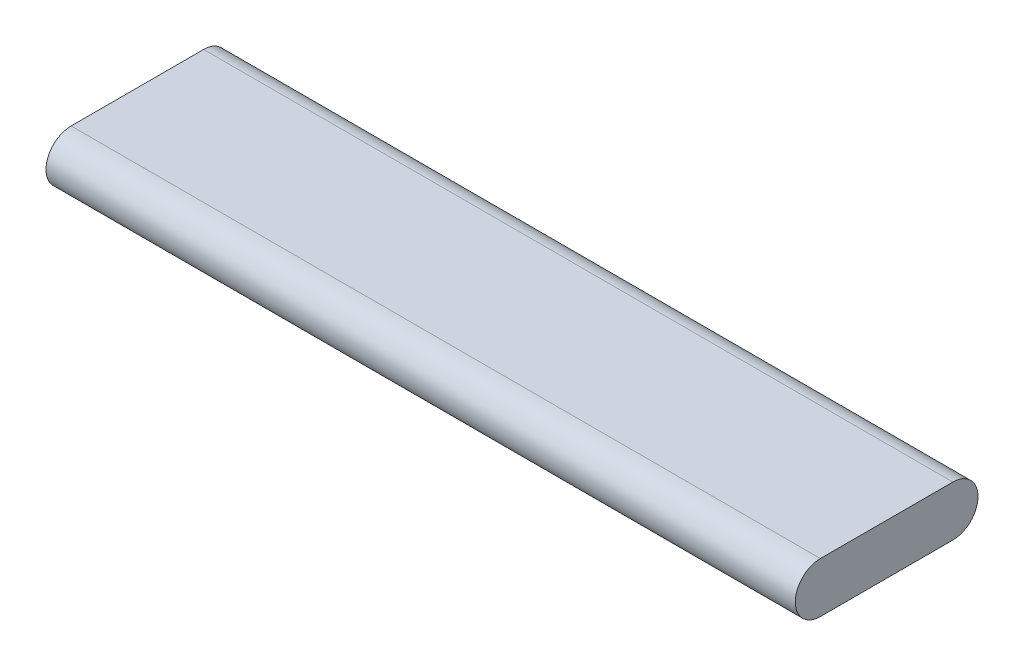
ISO-10303-21;
HEADER;
FILE_DESCRIPTION(('STEP AP214'),'2;1');
FILE_NAME('part.step','',(''),(''),'','','');
FILE_SCHEMA(('AUTOMOTIVE_DESIGN { 1 0 10303 214 1 1 1 1 }'));
ENDSEC;
DATA;
#1=APPLICATION_CONTEXT('core data for automotive mechanical design processes');
#2=APPLICATION_PROTOCOL_DEFINITION('international standard','automotive_design',2000,#1);
#3=PRODUCT_CONTEXT('',#1,'mechanical');
#4=PRODUCT('Part','Part','',(#3));
#5=PRODUCT_RELATED_PRODUCT_CATEGORY('part','',(#4));
#6=PRODUCT_DEFINITION_FORMATION('','',#4);
#7=PRODUCT_DEFINITION_CONTEXT('part definition',#1,'design');
#8=PRODUCT_DEFINITION('design','',#6,#7);
#9=PRODUCT_DEFINITION_SHAPE('','',#8);
#10=(LENGTH_UNIT() NAMED_UNIT(*) SI_UNIT(.MILLI.,.METRE.));
#11=(NAMED_UNIT(*) PLANE_ANGLE_UNIT() SI_UNIT($,.RADIAN.));
#12=(NAMED_UNIT(*) SI_UNIT($,.STERADIAN.) SOLID_ANGLE_UNIT());
#13=UNCERTAINTY_MEASURE_WITH_UNIT(LENGTH_MEASURE(1.E-05),#10,'distance_accuracy_value','');
#14=(GEOMETRIC_REPRESENTATION_CONTEXT(3) GLOBAL_UNCERTAINTY_ASSIGNED_CONTEXT((#13)) GLOBAL_UNIT_ASSIGNED_CONTEXT((#10,
#11,#12)) REPRESENTATION_CONTEXT('',''));
#15=CARTESIAN_POINT('',(0.,0.,0.));
#16=DIRECTION('',(0.,0.,1.));
#17=DIRECTION('',(1.,0.,0.));
#18=AXIS2_PLACEMENT_3D('',#15,#16,#17);
#19=CARTESIAN_POINT('',(0.,2.75,17.25));
#20=DIRECTION('',(1.,0.,0.));
#21=DIRECTION('',(0.,0.,-1.));
#22=AXIS2_PLACEMENT_3D('',#19,#20,#21);
#23=CYLINDRICAL_SURFACE('',#22,2.75);
#24=DIRECTION('',(-1.,0.,0.));
#25=VECTOR('',#24,1.);
#26=CARTESIAN_POINT('',(0.,5.5,17.25));
#27=LINE('',#26,#25);
#28=CARTESIAN_POINT('',(0.,5.5,17.25));
#29=VERTEX_POINT('',#28);
#30=CARTESIAN_POINT('',(82.,5.5,17.25));
#31=VERTEX_POINT('',#30);
#32=EDGE_CURVE('E92',#29,#31,#27,.F.);
#33=ORIENTED_EDGE('',*,*,#32,.F.);
#34=CARTESIAN_POINT('',(0.,2.75,17.25));
#35=DIRECTION('',(1.,0.,0.));
#36=DIRECTION('',(0.,0.,-1.));
#37=AXIS2_PLACEMENT_3D('',#34,#35,#36);
#38=CIRCLE('',#37,2.75);
#39=CARTESIAN_POINT('',(0.,0.,17.25));
#40=VERTEX_POINT('',#39);
#41=EDGE_CURVE('E50',#40,#29,#38,.F.);
#42=ORIENTED_EDGE('',*,*,#41,.F.);
#43=DIRECTION('',(1.,0.,0.));
#44=VECTOR('',#43,1.);
#45=CARTESIAN_POINT('',(0.,0.,17.25));
#46=LINE('',#45,#44);
#47=CARTESIAN_POINT('',(82.,0.,17.25));
#48=VERTEX_POINT('',#47);
#49=EDGE_CURVE('E122',#48,#40,#46,.F.);
#50=ORIENTED_EDGE('',*,*,#49,.F.);
#51=CARTESIAN_POINT('',(82.,2.75,17.25));
#52=DIRECTION('',(-1.,0.,0.));
#53=DIRECTION('',(0.,0.,1.));
#54=AXIS2_PLACEMENT_3D('',#51,#52,#53);
#55=CIRCLE('',#54,2.75);
#56=EDGE_CURVE('E11',#31,#48,#55,.F.);
#57=ORIENTED_EDGE('',*,*,#56,.F.);
#58=EDGE_LOOP('',(#33,#42,#50,#57));
#59=FACE_BOUND('',#58,.T.);
#60=ADVANCED_FACE('F41',(#59),#23,.T.);
#61=CARTESIAN_POINT('',(82.,2.75,2.75));
#62=DIRECTION('',(-1.,0.,0.));
#63=DIRECTION('',(0.,0.,1.));
#64=AXIS2_PLACEMENT_3D('',#61,#62,#63);
#65=CYLINDRICAL_SURFACE('',#64,2.75);
#66=DIRECTION('',(1.,0.,0.));
#67=VECTOR('',#66,1.);
#68=CARTESIAN_POINT('',(82.,5.5,2.75));
#69=LINE('',#68,#67);
#70=CARTESIAN_POINT('',(82.,5.5,2.75));
#71=VERTEX_POINT('',#70);
#72=CARTESIAN_POINT('',(0.,5.5,2.75));
#73=VERTEX_POINT('',#72);
#74=EDGE_CURVE('E84',#71,#73,#69,.F.);
#75=ORIENTED_EDGE('',*,*,#74,.F.);
#76=CARTESIAN_POINT('',(82.,2.75,2.75));
#77=DIRECTION('',(-1.,0.,0.));
#78=DIRECTION('',(0.,0.,1.));
#79=AXIS2_PLACEMENT_3D('',#76,#77,#78);
#80=CIRCLE('',#79,2.75);
#81=CARTESIAN_POINT('',(82.,0.,2.75));
#82=VERTEX_POINT('',#81);
#83=EDGE_CURVE('E93',#82,#71,#80,.F.);
#84=ORIENTED_EDGE('',*,*,#83,.F.);
#85=DIRECTION('',(-1.,0.,0.));
#86=VECTOR('',#85,1.);
#87=CARTESIAN_POINT('',(0.,0.,2.75));
#88=LINE('',#87,#86);
#89=CARTESIAN_POINT('',(0.,0.,2.75));
#90=VERTEX_POINT('',#89);
#91=EDGE_CURVE('E86',#90,#82,#88,.F.);
#92=ORIENTED_EDGE('',*,*,#91,.F.);
#93=CARTESIAN_POINT('',(0.,2.75,2.75));
#94=DIRECTION('',(1.,0.,0.));
#95=DIRECTION('',(0.,0.,-1.));
#96=AXIS2_PLACEMENT_3D('',#93,#94,#95);
#97=CIRCLE('',#96,2.75);
#98=EDGE_CURVE('E80',#73,#90,#97,.F.);
#99=ORIENTED_EDGE('',*,*,#98,.F.);
#100=EDGE_LOOP('',(#75,#84,#92,#99));
#101=FACE_BOUND('',#100,.T.);
#102=ADVANCED_FACE('F82',(#101),#65,.T.);
#103=CARTESIAN_POINT('',(0.,5.5,0.));
#104=DIRECTION('',(1.,0.,0.));
#105=DIRECTION('',(0.,0.,-1.));
#106=AXIS2_PLACEMENT_3D('',#103,#104,#105);
#107=PLANE('',#106);
#108=DIRECTION('',(0.,0.,1.));
#109=VECTOR('',#108,1.);
#110=CARTESIAN_POINT('',(0.,0.,0.));
#111=LINE('',#110,#109);
#112=EDGE_CURVE('E111',#90,#40,#111,.T.);
#113=ORIENTED_EDGE('',*,*,#112,.T.);
#114=ORIENTED_EDGE('',*,*,#41,.T.);
#115=DIRECTION('',(0.,0.,1.));
#116=VECTOR('',#115,1.);
#117=CARTESIAN_POINT('',(0.,5.5,0.));
#118=LINE('',#117,#116);
#119=EDGE_CURVE('E99',#73,#29,#118,.T.);
#120=ORIENTED_EDGE('',*,*,#119,.F.);
#121=ORIENTED_EDGE('',*,*,#98,.T.);
#122=EDGE_LOOP('',(#113,#114,#120,#121));
#123=FACE_BOUND('',#122,.T.);
#124=ADVANCED_FACE('F104',(#123),#107,.F.);
#125=CARTESIAN_POINT('',(82.,5.5,0.));
#126=DIRECTION('',(-1.,0.,0.));
#127=DIRECTION('',(0.,0.,1.));
#128=AXIS2_PLACEMENT_3D('',#125,#126,#127);
#129=PLANE('',#128);
#130=DIRECTION('',(0.,0.,-1.));
#131=VECTOR('',#130,1.);
#132=CARTESIAN_POINT('',(82.,5.5,0.));
#133=LINE('',#132,#131);
#134=EDGE_CURVE('E100',#31,#71,#133,.T.);
#135=ORIENTED_EDGE('',*,*,#134,.F.);
#136=ORIENTED_EDGE('',*,*,#56,.T.);
#137=DIRECTION('',(0.,0.,-1.));
#138=VECTOR('',#137,1.);
#139=CARTESIAN_POINT('',(82.,0.,0.));
#140=LINE('',#139,#138);
#141=EDGE_CURVE('E106',#48,#82,#140,.T.);
#142=ORIENTED_EDGE('',*,*,#141,.T.);
#143=ORIENTED_EDGE('',*,*,#83,.T.);
#144=EDGE_LOOP('',(#135,#136,#142,#143));
#145=FACE_BOUND('',#144,.T.);
#146=ADVANCED_FACE('F128',(#145),#129,.F.);
#147=CARTESIAN_POINT('',(0.,5.5,0.));
#148=DIRECTION('',(0.,1.,0.));
#149=DIRECTION('',(0.,0.,1.));
#150=AXIS2_PLACEMENT_3D('',#147,#148,#149);
#151=PLANE('',#150);
#152=ORIENTED_EDGE('',*,*,#119,.T.);
#153=ORIENTED_EDGE('',*,*,#32,.T.);
#154=ORIENTED_EDGE('',*,*,#134,.T.);
#155=ORIENTED_EDGE('',*,*,#74,.T.);
#156=EDGE_LOOP('',(#152,#153,#154,#155));
#157=FACE_BOUND('',#156,.T.);
#158=ADVANCED_FACE('F97',(#157),#151,.T.);
#159=CARTESIAN_POINT('',(0.,0.,0.));
#160=DIRECTION('',(0.,1.,0.));
#161=DIRECTION('',(0.,0.,1.));
#162=AXIS2_PLACEMENT_3D('',#159,#160,#161);
#163=PLANE('',#162);
#164=ORIENTED_EDGE('',*,*,#141,.F.);
#165=ORIENTED_EDGE('',*,*,#49,.T.);
#166=ORIENTED_EDGE('',*,*,#112,.F.);
#167=ORIENTED_EDGE('',*,*,#91,.T.);
#168=EDGE_LOOP('',(#164,#165,#166,#167));
#169=FACE_BOUND('',#168,.T.);
#170=ADVANCED_FACE('F127',(#169),#163,.F.);
#171=CLOSED_SHELL('',(#60,#102,#124,#146,#158,#170));
#172=MANIFOLD_SOLID_BREP('B2',#171);
#173=ADVANCED_BREP_SHAPE_REPRESENTATION('',(#18,#172),#14);
#174=SHAPE_DEFINITION_REPRESENTATION(#9,#173);
ENDSEC;
END-ISO-10303-21;
